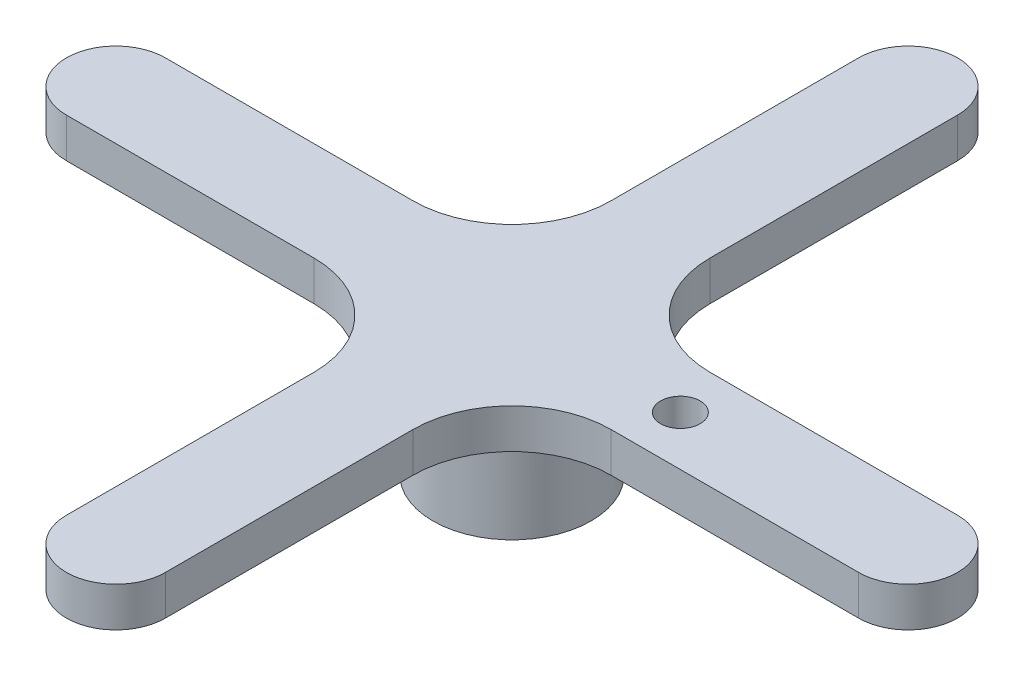
ISO-10303-21;
HEADER;
FILE_DESCRIPTION(('STEP AP214'),'2;1');
FILE_NAME('part.step','',(''),(''),'','','');
FILE_SCHEMA(('AUTOMOTIVE_DESIGN { 1 0 10303 214 1 1 1 1 }'));
ENDSEC;
DATA;
#1=APPLICATION_CONTEXT('core data for automotive mechanical design processes');
#2=APPLICATION_PROTOCOL_DEFINITION('international standard','automotive_design',2000,#1);
#3=PRODUCT_CONTEXT('',#1,'mechanical');
#4=PRODUCT('Part','Part','',(#3));
#5=PRODUCT_RELATED_PRODUCT_CATEGORY('part','',(#4));
#6=PRODUCT_DEFINITION_FORMATION('','',#4);
#7=PRODUCT_DEFINITION_CONTEXT('part definition',#1,'design');
#8=PRODUCT_DEFINITION('design','',#6,#7);
#9=PRODUCT_DEFINITION_SHAPE('','',#8);
#10=(LENGTH_UNIT() NAMED_UNIT(*) SI_UNIT(.MILLI.,.METRE.));
#11=(NAMED_UNIT(*) PLANE_ANGLE_UNIT() SI_UNIT($,.RADIAN.));
#12=(NAMED_UNIT(*) SI_UNIT($,.STERADIAN.) SOLID_ANGLE_UNIT());
#13=UNCERTAINTY_MEASURE_WITH_UNIT(LENGTH_MEASURE(1.E-05),#10,'distance_accuracy_value','');
#14=(GEOMETRIC_REPRESENTATION_CONTEXT(3) GLOBAL_UNCERTAINTY_ASSIGNED_CONTEXT((#13)) GLOBAL_UNIT_ASSIGNED_CONTEXT((#10,
#11,#12)) REPRESENTATION_CONTEXT('',''));
#15=CARTESIAN_POINT('',(0.,0.,0.));
#16=DIRECTION('',(0.,0.,1.));
#17=DIRECTION('',(1.,0.,0.));
#18=AXIS2_PLACEMENT_3D('',#15,#16,#17);
#19=CARTESIAN_POINT('',(-20.,0.,0.));
#20=DIRECTION('',(0.,1.,0.));
#21=DIRECTION('',(0.,0.,1.));
#22=AXIS2_PLACEMENT_3D('',#19,#20,#21);
#23=PLANE('',#22);
#24=CARTESIAN_POINT('',(-20.,0.,0.));
#25=DIRECTION('',(0.,1.,0.));
#26=DIRECTION('',(0.,0.,1.));
#27=AXIS2_PLACEMENT_3D('',#24,#25,#26);
#28=CIRCLE('',#27,2.5);
#29=CARTESIAN_POINT('',(-20.,0.,-2.5));
#30=VERTEX_POINT('',#29);
#31=CARTESIAN_POINT('',(-20.,0.,2.5));
#32=VERTEX_POINT('',#31);
#33=EDGE_CURVE('E232',#30,#32,#28,.T.);
#34=ORIENTED_EDGE('',*,*,#33,.F.);
#35=DIRECTION('',(1.,0.,0.));
#36=VECTOR('',#35,1.);
#37=CARTESIAN_POINT('',(-20.,0.,-2.5));
#38=LINE('',#37,#36);
#39=CARTESIAN_POINT('',(-7.50000000000004,0.,-2.5));
#40=VERTEX_POINT('',#39);
#41=EDGE_CURVE('E273',#30,#40,#38,.T.);
#42=ORIENTED_EDGE('',*,*,#41,.T.);
#43=CARTESIAN_POINT('',(-7.5,0.,-7.5));
#44=DIRECTION('',(0.,1.,0.));
#45=DIRECTION('',(0.,0.,1.));
#46=AXIS2_PLACEMENT_3D('',#43,#44,#45);
#47=CIRCLE('',#46,5.);
#48=CARTESIAN_POINT('',(-2.5,0.,-7.50000000000003));
#49=VERTEX_POINT('',#48);
#50=EDGE_CURVE('E271',#40,#49,#47,.T.);
#51=ORIENTED_EDGE('',*,*,#50,.T.);
#52=DIRECTION('',(0.,0.,1.));
#53=VECTOR('',#52,1.);
#54=CARTESIAN_POINT('',(-2.5,0.,-20.));
#55=LINE('',#54,#53);
#56=CARTESIAN_POINT('',(-2.5,0.,-20.));
#57=VERTEX_POINT('',#56);
#58=EDGE_CURVE('E221',#57,#49,#55,.T.);
#59=ORIENTED_EDGE('',*,*,#58,.F.);
#60=CARTESIAN_POINT('',(0.,0.,-20.));
#61=DIRECTION('',(0.,-1.,0.));
#62=DIRECTION('',(0.,0.,-1.));
#63=AXIS2_PLACEMENT_3D('',#60,#61,#62);
#64=CIRCLE('',#63,2.5);
#65=CARTESIAN_POINT('',(2.5,0.,-20.));
#66=VERTEX_POINT('',#65);
#67=EDGE_CURVE('E267',#57,#66,#64,.T.);
#68=ORIENTED_EDGE('',*,*,#67,.T.);
#69=DIRECTION('',(0.,0.,1.));
#70=VECTOR('',#69,1.);
#71=CARTESIAN_POINT('',(2.5,0.,-20.));
#72=LINE('',#71,#70);
#73=CARTESIAN_POINT('',(2.50000000000001,0.,-7.50000000000002));
#74=VERTEX_POINT('',#73);
#75=EDGE_CURVE('E264',#66,#74,#72,.T.);
#76=ORIENTED_EDGE('',*,*,#75,.T.);
#77=CARTESIAN_POINT('',(7.5,0.,-7.5));
#78=DIRECTION('',(0.,1.,0.));
#79=DIRECTION('',(0.,0.,1.));
#80=AXIS2_PLACEMENT_3D('',#77,#78,#79);
#81=CIRCLE('',#80,4.99999999999999);
#82=CARTESIAN_POINT('',(7.49999999999999,0.,-2.50000000000001));
#83=VERTEX_POINT('',#82);
#84=EDGE_CURVE('E261',#74,#83,#81,.T.);
#85=ORIENTED_EDGE('',*,*,#84,.T.);
#86=DIRECTION('',(1.,0.,0.));
#87=VECTOR('',#86,1.);
#88=CARTESIAN_POINT('',(7.49999999999999,0.,-2.50000000000001));
#89=LINE('',#88,#87);
#90=CARTESIAN_POINT('',(20.,0.,-2.5));
#91=VERTEX_POINT('',#90);
#92=EDGE_CURVE('E258',#83,#91,#89,.T.);
#93=ORIENTED_EDGE('',*,*,#92,.T.);
#94=CARTESIAN_POINT('',(20.,0.,0.));
#95=DIRECTION('',(0.,-1.,0.));
#96=DIRECTION('',(0.,0.,-1.));
#97=AXIS2_PLACEMENT_3D('',#94,#95,#96);
#98=CIRCLE('',#97,2.5);
#99=CARTESIAN_POINT('',(20.,0.,2.5));
#100=VERTEX_POINT('',#99);
#101=EDGE_CURVE('E255',#91,#100,#98,.T.);
#102=ORIENTED_EDGE('',*,*,#101,.T.);
#103=DIRECTION('',(1.,0.,0.));
#104=VECTOR('',#103,1.);
#105=CARTESIAN_POINT('',(7.50000000000004,0.,2.5));
#106=LINE('',#105,#104);
#107=CARTESIAN_POINT('',(7.50000000000004,0.,2.5));
#108=VERTEX_POINT('',#107);
#109=EDGE_CURVE('E252',#108,#100,#106,.T.);
#110=ORIENTED_EDGE('',*,*,#109,.F.);
#111=CARTESIAN_POINT('',(7.5,0.,7.5));
#112=DIRECTION('',(0.,1.,0.));
#113=DIRECTION('',(0.,0.,1.));
#114=AXIS2_PLACEMENT_3D('',#111,#112,#113);
#115=CIRCLE('',#114,5.);
#116=CARTESIAN_POINT('',(2.5,0.,7.50000000000004));
#117=VERTEX_POINT('',#116);
#118=EDGE_CURVE('E249',#108,#117,#115,.T.);
#119=ORIENTED_EDGE('',*,*,#118,.T.);
#120=DIRECTION('',(0.,0.,1.));
#121=VECTOR('',#120,1.);
#122=CARTESIAN_POINT('',(2.5,0.,7.50000000000004));
#123=LINE('',#122,#121);
#124=CARTESIAN_POINT('',(2.5,0.,20.));
#125=VERTEX_POINT('',#124);
#126=EDGE_CURVE('E246',#117,#125,#123,.T.);
#127=ORIENTED_EDGE('',*,*,#126,.T.);
#128=CARTESIAN_POINT('',(0.,0.,20.));
#129=DIRECTION('',(0.,1.,0.));
#130=DIRECTION('',(0.,0.,1.));
#131=AXIS2_PLACEMENT_3D('',#128,#129,#130);
#132=CIRCLE('',#131,2.5);
#133=CARTESIAN_POINT('',(-2.5,0.,20.));
#134=VERTEX_POINT('',#133);
#135=EDGE_CURVE('E243',#134,#125,#132,.T.);
#136=ORIENTED_EDGE('',*,*,#135,.F.);
#137=DIRECTION('',(0.,0.,1.));
#138=VECTOR('',#137,1.);
#139=CARTESIAN_POINT('',(-2.5,0.,7.50000000000003));
#140=LINE('',#139,#138);
#141=CARTESIAN_POINT('',(-2.5,0.,7.50000000000003));
#142=VERTEX_POINT('',#141);
#143=EDGE_CURVE('E241',#142,#134,#140,.T.);
#144=ORIENTED_EDGE('',*,*,#143,.F.);
#145=CARTESIAN_POINT('',(-7.5,0.,7.5));
#146=DIRECTION('',(0.,1.,0.));
#147=DIRECTION('',(0.,0.,1.));
#148=AXIS2_PLACEMENT_3D('',#145,#146,#147);
#149=CIRCLE('',#148,5.);
#150=CARTESIAN_POINT('',(-7.50000000000004,0.,2.5));
#151=VERTEX_POINT('',#150);
#152=EDGE_CURVE('E238',#142,#151,#149,.T.);
#153=ORIENTED_EDGE('',*,*,#152,.T.);
#154=DIRECTION('',(1.,0.,0.));
#155=VECTOR('',#154,1.);
#156=CARTESIAN_POINT('',(-20.,0.,2.5));
#157=LINE('',#156,#155);
#158=EDGE_CURVE('E234',#32,#151,#157,.T.);
#159=ORIENTED_EDGE('',*,*,#158,.F.);
#160=EDGE_LOOP('',(#34,#42,#51,#59,#68,#76,#85,#93,#102,#110,#119,#127,#136,#144,#153,#159));
#161=FACE_BOUND('',#160,.T.);
#162=CARTESIAN_POINT('',(8.5,0.,0.));
#163=DIRECTION('',(0.,1.,0.));
#164=DIRECTION('',(0.,0.,1.));
#165=AXIS2_PLACEMENT_3D('',#162,#163,#164);
#166=CIRCLE('',#165,1.);
#167=CARTESIAN_POINT('',(8.5,0.,1.));
#168=VERTEX_POINT('',#167);
#169=EDGE_CURVE('E346',#168,#168,#166,.T.);
#170=ORIENTED_EDGE('',*,*,#169,.T.);
#171=EDGE_LOOP('',(#170));
#172=FACE_BOUND('',#171,.T.);
#173=CARTESIAN_POINT('',(0.,0.,0.));
#174=DIRECTION('',(0.,1.,0.));
#175=DIRECTION('',(0.,0.,1.));
#176=AXIS2_PLACEMENT_3D('',#173,#174,#175);
#177=CIRCLE('',#176,4.);
#178=CARTESIAN_POINT('',(0.,0.,4.));
#179=VERTEX_POINT('',#178);
#180=EDGE_CURVE('E12',#179,#179,#177,.F.);
#181=ORIENTED_EDGE('',*,*,#180,.F.);
#182=EDGE_LOOP('',(#181));
#183=FACE_BOUND('',#182,.T.);
#184=ADVANCED_FACE('F84',(#161,#172,#183),#23,.F.);
#185=CARTESIAN_POINT('',(-20.,2.,0.));
#186=DIRECTION('',(0.,1.,0.));
#187=DIRECTION('',(0.,0.,1.));
#188=AXIS2_PLACEMENT_3D('',#185,#186,#187);
#189=PLANE('',#188);
#190=CARTESIAN_POINT('',(-20.,2.,0.));
#191=DIRECTION('',(0.,1.,0.));
#192=DIRECTION('',(0.,0.,1.));
#193=AXIS2_PLACEMENT_3D('',#190,#191,#192);
#194=CIRCLE('',#193,2.5);
#195=CARTESIAN_POINT('',(-20.,2.,-2.5));
#196=VERTEX_POINT('',#195);
#197=CARTESIAN_POINT('',(-20.,2.,2.5));
#198=VERTEX_POINT('',#197);
#199=EDGE_CURVE('E276',#196,#198,#194,.T.);
#200=ORIENTED_EDGE('',*,*,#199,.T.);
#201=DIRECTION('',(1.,0.,0.));
#202=VECTOR('',#201,1.);
#203=CARTESIAN_POINT('',(-20.,2.,2.5));
#204=LINE('',#203,#202);
#205=CARTESIAN_POINT('',(-7.50000000000004,2.,2.5));
#206=VERTEX_POINT('',#205);
#207=EDGE_CURVE('E164',#198,#206,#204,.T.);
#208=ORIENTED_EDGE('',*,*,#207,.T.);
#209=CARTESIAN_POINT('',(-7.5,2.,7.5));
#210=DIRECTION('',(0.,1.,0.));
#211=DIRECTION('',(0.,0.,1.));
#212=AXIS2_PLACEMENT_3D('',#209,#210,#211);
#213=CIRCLE('',#212,5.);
#214=CARTESIAN_POINT('',(-2.5,2.,7.50000000000003));
#215=VERTEX_POINT('',#214);
#216=EDGE_CURVE('E353',#215,#206,#213,.T.);
#217=ORIENTED_EDGE('',*,*,#216,.F.);
#218=DIRECTION('',(0.,0.,1.));
#219=VECTOR('',#218,1.);
#220=CARTESIAN_POINT('',(-2.5,2.,7.50000000000003));
#221=LINE('',#220,#219);
#222=CARTESIAN_POINT('',(-2.5,2.,20.));
#223=VERTEX_POINT('',#222);
#224=EDGE_CURVE('E356',#215,#223,#221,.T.);
#225=ORIENTED_EDGE('',*,*,#224,.T.);
#226=CARTESIAN_POINT('',(0.,2.,20.));
#227=DIRECTION('',(0.,1.,0.));
#228=DIRECTION('',(0.,0.,1.));
#229=AXIS2_PLACEMENT_3D('',#226,#227,#228);
#230=CIRCLE('',#229,2.5);
#231=CARTESIAN_POINT('',(2.5,2.,20.));
#232=VERTEX_POINT('',#231);
#233=EDGE_CURVE('E358',#223,#232,#230,.T.);
#234=ORIENTED_EDGE('',*,*,#233,.T.);
#235=DIRECTION('',(0.,0.,1.));
#236=VECTOR('',#235,1.);
#237=CARTESIAN_POINT('',(2.5,2.,7.50000000000004));
#238=LINE('',#237,#236);
#239=CARTESIAN_POINT('',(2.5,2.,7.50000000000004));
#240=VERTEX_POINT('',#239);
#241=EDGE_CURVE('E360',#240,#232,#238,.T.);
#242=ORIENTED_EDGE('',*,*,#241,.F.);
#243=CARTESIAN_POINT('',(7.5,2.,7.5));
#244=DIRECTION('',(0.,1.,0.));
#245=DIRECTION('',(0.,0.,1.));
#246=AXIS2_PLACEMENT_3D('',#243,#244,#245);
#247=CIRCLE('',#246,5.);
#248=CARTESIAN_POINT('',(7.50000000000004,2.,2.5));
#249=VERTEX_POINT('',#248);
#250=EDGE_CURVE('E363',#249,#240,#247,.T.);
#251=ORIENTED_EDGE('',*,*,#250,.F.);
#252=DIRECTION('',(1.,0.,0.));
#253=VECTOR('',#252,1.);
#254=CARTESIAN_POINT('',(7.50000000000004,2.,2.5));
#255=LINE('',#254,#253);
#256=CARTESIAN_POINT('',(20.,2.,2.5));
#257=VERTEX_POINT('',#256);
#258=EDGE_CURVE('E366',#249,#257,#255,.T.);
#259=ORIENTED_EDGE('',*,*,#258,.T.);
#260=CARTESIAN_POINT('',(20.,2.,0.));
#261=DIRECTION('',(0.,-1.,0.));
#262=DIRECTION('',(0.,0.,-1.));
#263=AXIS2_PLACEMENT_3D('',#260,#261,#262);
#264=CIRCLE('',#263,2.5);
#265=CARTESIAN_POINT('',(20.,2.,-2.5));
#266=VERTEX_POINT('',#265);
#267=EDGE_CURVE('E368',#266,#257,#264,.T.);
#268=ORIENTED_EDGE('',*,*,#267,.F.);
#269=DIRECTION('',(1.,0.,0.));
#270=VECTOR('',#269,1.);
#271=CARTESIAN_POINT('',(7.49999999999999,2.,-2.50000000000001));
#272=LINE('',#271,#270);
#273=CARTESIAN_POINT('',(7.49999999999999,2.,-2.50000000000001));
#274=VERTEX_POINT('',#273);
#275=EDGE_CURVE('E371',#274,#266,#272,.T.);
#276=ORIENTED_EDGE('',*,*,#275,.F.);
#277=CARTESIAN_POINT('',(7.5,2.,-7.5));
#278=DIRECTION('',(0.,1.,0.));
#279=DIRECTION('',(0.,0.,1.));
#280=AXIS2_PLACEMENT_3D('',#277,#278,#279);
#281=CIRCLE('',#280,4.99999999999999);
#282=CARTESIAN_POINT('',(2.50000000000001,2.,-7.50000000000002));
#283=VERTEX_POINT('',#282);
#284=EDGE_CURVE('E374',#283,#274,#281,.T.);
#285=ORIENTED_EDGE('',*,*,#284,.F.);
#286=DIRECTION('',(0.,0.,1.));
#287=VECTOR('',#286,1.);
#288=CARTESIAN_POINT('',(2.5,2.,-20.));
#289=LINE('',#288,#287);
#290=CARTESIAN_POINT('',(2.5,2.,-20.));
#291=VERTEX_POINT('',#290);
#292=EDGE_CURVE('E377',#291,#283,#289,.T.);
#293=ORIENTED_EDGE('',*,*,#292,.F.);
#294=CARTESIAN_POINT('',(0.,2.,-20.));
#295=DIRECTION('',(0.,-1.,0.));
#296=DIRECTION('',(0.,0.,-1.));
#297=AXIS2_PLACEMENT_3D('',#294,#295,#296);
#298=CIRCLE('',#297,2.5);
#299=CARTESIAN_POINT('',(-2.5,2.,-20.));
#300=VERTEX_POINT('',#299);
#301=EDGE_CURVE('E214',#300,#291,#298,.T.);
#302=ORIENTED_EDGE('',*,*,#301,.F.);
#303=DIRECTION('',(0.,0.,1.));
#304=VECTOR('',#303,1.);
#305=CARTESIAN_POINT('',(-2.5,2.,-20.));
#306=LINE('',#305,#304);
#307=CARTESIAN_POINT('',(-2.5,2.,-7.50000000000003));
#308=VERTEX_POINT('',#307);
#309=EDGE_CURVE('E205',#300,#308,#306,.T.);
#310=ORIENTED_EDGE('',*,*,#309,.T.);
#311=CARTESIAN_POINT('',(-7.5,2.,-7.5));
#312=DIRECTION('',(0.,1.,0.));
#313=DIRECTION('',(0.,0.,1.));
#314=AXIS2_PLACEMENT_3D('',#311,#312,#313);
#315=CIRCLE('',#314,5.);
#316=CARTESIAN_POINT('',(-7.50000000000004,2.,-2.5));
#317=VERTEX_POINT('',#316);
#318=EDGE_CURVE('E211',#317,#308,#315,.T.);
#319=ORIENTED_EDGE('',*,*,#318,.F.);
#320=DIRECTION('',(1.,0.,0.));
#321=VECTOR('',#320,1.);
#322=CARTESIAN_POINT('',(-20.,2.,-2.5));
#323=LINE('',#322,#321);
#324=EDGE_CURVE('E227',#196,#317,#323,.T.);
#325=ORIENTED_EDGE('',*,*,#324,.F.);
#326=EDGE_LOOP('',(#200,#208,#217,#225,#234,#242,#251,#259,#268,#276,#285,#293,#302,#310,#319,#325));
#327=FACE_BOUND('',#326,.T.);
#328=CARTESIAN_POINT('',(8.5,2.,0.));
#329=DIRECTION('',(0.,1.,0.));
#330=DIRECTION('',(0.,0.,1.));
#331=AXIS2_PLACEMENT_3D('',#328,#329,#330);
#332=CIRCLE('',#331,1.);
#333=CARTESIAN_POINT('',(8.5,2.,1.));
#334=VERTEX_POINT('',#333);
#335=EDGE_CURVE('E235',#334,#334,#332,.T.);
#336=ORIENTED_EDGE('',*,*,#335,.F.);
#337=EDGE_LOOP('',(#336));
#338=FACE_BOUND('',#337,.T.);
#339=ADVANCED_FACE('F207',(#327,#338),#189,.T.);
#340=CARTESIAN_POINT('',(-20.,2.,0.));
#341=DIRECTION('',(0.,-1.,0.));
#342=DIRECTION('',(0.,0.,-1.));
#343=AXIS2_PLACEMENT_3D('',#340,#341,#342);
#344=CYLINDRICAL_SURFACE('',#343,2.5);
#345=ORIENTED_EDGE('',*,*,#33,.T.);
#346=DIRECTION('',(0.,-1.,0.));
#347=VECTOR('',#346,1.);
#348=CARTESIAN_POINT('',(-20.,2.,2.5));
#349=LINE('',#348,#347);
#350=EDGE_CURVE('E93',#198,#32,#349,.T.);
#351=ORIENTED_EDGE('',*,*,#350,.F.);
#352=ORIENTED_EDGE('',*,*,#199,.F.);
#353=DIRECTION('',(0.,-1.,0.));
#354=VECTOR('',#353,1.);
#355=CARTESIAN_POINT('',(-20.,2.,-2.5));
#356=LINE('',#355,#354);
#357=EDGE_CURVE('E101',#196,#30,#356,.T.);
#358=ORIENTED_EDGE('',*,*,#357,.T.);
#359=EDGE_LOOP('',(#345,#351,#352,#358));
#360=FACE_BOUND('',#359,.T.);
#361=ADVANCED_FACE('F86',(#360),#344,.T.);
#362=CARTESIAN_POINT('',(-20.,2.,2.5));
#363=DIRECTION('',(0.,0.,-1.));
#364=DIRECTION('',(-1.,0.,0.));
#365=AXIS2_PLACEMENT_3D('',#362,#363,#364);
#366=PLANE('',#365);
#367=ORIENTED_EDGE('',*,*,#158,.T.);
#368=DIRECTION('',(0.,-1.,0.));
#369=VECTOR('',#368,1.);
#370=CARTESIAN_POINT('',(-7.50000000000004,2.,2.5));
#371=LINE('',#370,#369);
#372=EDGE_CURVE('E301',#206,#151,#371,.T.);
#373=ORIENTED_EDGE('',*,*,#372,.F.);
#374=ORIENTED_EDGE('',*,*,#207,.F.);
#375=ORIENTED_EDGE('',*,*,#350,.T.);
#376=EDGE_LOOP('',(#367,#373,#374,#375));
#377=FACE_BOUND('',#376,.T.);
#378=ADVANCED_FACE('F303',(#377),#366,.F.);
#379=CARTESIAN_POINT('',(-7.5,2.,7.5));
#380=DIRECTION('',(0.,-1.,0.));
#381=DIRECTION('',(0.,0.,-1.));
#382=AXIS2_PLACEMENT_3D('',#379,#380,#381);
#383=CYLINDRICAL_SURFACE('',#382,5.);
#384=ORIENTED_EDGE('',*,*,#152,.F.);
#385=DIRECTION('',(0.,-1.,0.));
#386=VECTOR('',#385,1.);
#387=CARTESIAN_POINT('',(-2.5,2.,7.50000000000003));
#388=LINE('',#387,#386);
#389=EDGE_CURVE('E299',#215,#142,#388,.T.);
#390=ORIENTED_EDGE('',*,*,#389,.F.);
#391=ORIENTED_EDGE('',*,*,#216,.T.);
#392=ORIENTED_EDGE('',*,*,#372,.T.);
#393=EDGE_LOOP('',(#384,#390,#391,#392));
#394=FACE_BOUND('',#393,.T.);
#395=ADVANCED_FACE('F423',(#394),#383,.F.);
#396=CARTESIAN_POINT('',(-2.5,2.,7.50000000000003));
#397=DIRECTION('',(1.,0.,0.));
#398=DIRECTION('',(0.,0.,-1.));
#399=AXIS2_PLACEMENT_3D('',#396,#397,#398);
#400=PLANE('',#399);
#401=ORIENTED_EDGE('',*,*,#143,.T.);
#402=DIRECTION('',(0.,-1.,0.));
#403=VECTOR('',#402,1.);
#404=CARTESIAN_POINT('',(-2.5,2.,20.));
#405=LINE('',#404,#403);
#406=EDGE_CURVE('E296',#223,#134,#405,.T.);
#407=ORIENTED_EDGE('',*,*,#406,.F.);
#408=ORIENTED_EDGE('',*,*,#224,.F.);
#409=ORIENTED_EDGE('',*,*,#389,.T.);
#410=EDGE_LOOP('',(#401,#407,#408,#409));
#411=FACE_BOUND('',#410,.T.);
#412=ADVANCED_FACE('F419',(#411),#400,.F.);
#413=CARTESIAN_POINT('',(0.,2.,20.));
#414=DIRECTION('',(0.,-1.,0.));
#415=DIRECTION('',(0.,0.,-1.));
#416=AXIS2_PLACEMENT_3D('',#413,#414,#415);
#417=CYLINDRICAL_SURFACE('',#416,2.5);
#418=ORIENTED_EDGE('',*,*,#135,.T.);
#419=DIRECTION('',(0.,-1.,0.));
#420=VECTOR('',#419,1.);
#421=CARTESIAN_POINT('',(2.5,2.,20.));
#422=LINE('',#421,#420);
#423=EDGE_CURVE('E294',#232,#125,#422,.T.);
#424=ORIENTED_EDGE('',*,*,#423,.F.);
#425=ORIENTED_EDGE('',*,*,#233,.F.);
#426=ORIENTED_EDGE('',*,*,#406,.T.);
#427=EDGE_LOOP('',(#418,#424,#425,#426));
#428=FACE_BOUND('',#427,.T.);
#429=ADVANCED_FACE('F415',(#428),#417,.T.);
#430=CARTESIAN_POINT('',(2.5,2.,7.50000000000004));
#431=DIRECTION('',(1.,0.,0.));
#432=DIRECTION('',(0.,0.,-1.));
#433=AXIS2_PLACEMENT_3D('',#430,#431,#432);
#434=PLANE('',#433);
#435=ORIENTED_EDGE('',*,*,#126,.F.);
#436=DIRECTION('',(0.,-1.,0.));
#437=VECTOR('',#436,1.);
#438=CARTESIAN_POINT('',(2.5,2.,7.50000000000004));
#439=LINE('',#438,#437);
#440=EDGE_CURVE('E292',#240,#117,#439,.T.);
#441=ORIENTED_EDGE('',*,*,#440,.F.);
#442=ORIENTED_EDGE('',*,*,#241,.T.);
#443=ORIENTED_EDGE('',*,*,#423,.T.);
#444=EDGE_LOOP('',(#435,#441,#442,#443));
#445=FACE_BOUND('',#444,.T.);
#446=ADVANCED_FACE('F410',(#445),#434,.T.);
#447=CARTESIAN_POINT('',(7.5,2.,7.5));
#448=DIRECTION('',(0.,-1.,0.));
#449=DIRECTION('',(0.,0.,-1.));
#450=AXIS2_PLACEMENT_3D('',#447,#448,#449);
#451=CYLINDRICAL_SURFACE('',#450,5.);
#452=ORIENTED_EDGE('',*,*,#118,.F.);
#453=DIRECTION('',(0.,-1.,0.));
#454=VECTOR('',#453,1.);
#455=CARTESIAN_POINT('',(7.50000000000004,2.,2.5));
#456=LINE('',#455,#454);
#457=EDGE_CURVE('E290',#249,#108,#456,.T.);
#458=ORIENTED_EDGE('',*,*,#457,.F.);
#459=ORIENTED_EDGE('',*,*,#250,.T.);
#460=ORIENTED_EDGE('',*,*,#440,.T.);
#461=EDGE_LOOP('',(#452,#458,#459,#460));
#462=FACE_BOUND('',#461,.T.);
#463=ADVANCED_FACE('F405',(#462),#451,.F.);
#464=CARTESIAN_POINT('',(7.50000000000004,2.,2.5));
#465=DIRECTION('',(0.,0.,-1.));
#466=DIRECTION('',(-1.,0.,0.));
#467=AXIS2_PLACEMENT_3D('',#464,#465,#466);
#468=PLANE('',#467);
#469=ORIENTED_EDGE('',*,*,#109,.T.);
#470=DIRECTION('',(0.,-1.,0.));
#471=VECTOR('',#470,1.);
#472=CARTESIAN_POINT('',(20.,2.,2.5));
#473=LINE('',#472,#471);
#474=EDGE_CURVE('E288',#257,#100,#473,.T.);
#475=ORIENTED_EDGE('',*,*,#474,.F.);
#476=ORIENTED_EDGE('',*,*,#258,.F.);
#477=ORIENTED_EDGE('',*,*,#457,.T.);
#478=EDGE_LOOP('',(#469,#475,#476,#477));
#479=FACE_BOUND('',#478,.T.);
#480=ADVANCED_FACE('F402',(#479),#468,.F.);
#481=CARTESIAN_POINT('',(20.,2.,0.));
#482=DIRECTION('',(0.,-1.,0.));
#483=DIRECTION('',(0.,0.,-1.));
#484=AXIS2_PLACEMENT_3D('',#481,#482,#483);
#485=CYLINDRICAL_SURFACE('',#484,2.5);
#486=ORIENTED_EDGE('',*,*,#101,.F.);
#487=DIRECTION('',(0.,-1.,0.));
#488=VECTOR('',#487,1.);
#489=CARTESIAN_POINT('',(20.,2.,-2.5));
#490=LINE('',#489,#488);
#491=EDGE_CURVE('E286',#266,#91,#490,.T.);
#492=ORIENTED_EDGE('',*,*,#491,.F.);
#493=ORIENTED_EDGE('',*,*,#267,.T.);
#494=ORIENTED_EDGE('',*,*,#474,.T.);
#495=EDGE_LOOP('',(#486,#492,#493,#494));
#496=FACE_BOUND('',#495,.T.);
#497=ADVANCED_FACE('F397',(#496),#485,.T.);
#498=CARTESIAN_POINT('',(7.49999999999999,2.,-2.50000000000001));
#499=DIRECTION('',(0.,0.,-1.));
#500=DIRECTION('',(-1.,0.,0.));
#501=AXIS2_PLACEMENT_3D('',#498,#499,#500);
#502=PLANE('',#501);
#503=ORIENTED_EDGE('',*,*,#92,.F.);
#504=DIRECTION('',(0.,-1.,0.));
#505=VECTOR('',#504,1.);
#506=CARTESIAN_POINT('',(7.49999999999999,2.,-2.50000000000001));
#507=LINE('',#506,#505);
#508=EDGE_CURVE('E284',#274,#83,#507,.T.);
#509=ORIENTED_EDGE('',*,*,#508,.F.);
#510=ORIENTED_EDGE('',*,*,#275,.T.);
#511=ORIENTED_EDGE('',*,*,#491,.T.);
#512=EDGE_LOOP('',(#503,#509,#510,#511));
#513=FACE_BOUND('',#512,.T.);
#514=ADVANCED_FACE('F392',(#513),#502,.T.);
#515=CARTESIAN_POINT('',(7.5,2.,-7.5));
#516=DIRECTION('',(0.,-1.,0.));
#517=DIRECTION('',(0.,0.,-1.));
#518=AXIS2_PLACEMENT_3D('',#515,#516,#517);
#519=CYLINDRICAL_SURFACE('',#518,4.99999999999999);
#520=ORIENTED_EDGE('',*,*,#84,.F.);
#521=DIRECTION('',(0.,-1.,0.));
#522=VECTOR('',#521,1.);
#523=CARTESIAN_POINT('',(2.50000000000001,2.,-7.50000000000002));
#524=LINE('',#523,#522);
#525=EDGE_CURVE('E282',#283,#74,#524,.T.);
#526=ORIENTED_EDGE('',*,*,#525,.F.);
#527=ORIENTED_EDGE('',*,*,#284,.T.);
#528=ORIENTED_EDGE('',*,*,#508,.T.);
#529=EDGE_LOOP('',(#520,#526,#527,#528));
#530=FACE_BOUND('',#529,.T.);
#531=ADVANCED_FACE('F388',(#530),#519,.F.);
#532=CARTESIAN_POINT('',(2.5,2.,-20.));
#533=DIRECTION('',(1.,0.,0.));
#534=DIRECTION('',(0.,0.,-1.));
#535=AXIS2_PLACEMENT_3D('',#532,#533,#534);
#536=PLANE('',#535);
#537=ORIENTED_EDGE('',*,*,#75,.F.);
#538=DIRECTION('',(0.,-1.,0.));
#539=VECTOR('',#538,1.);
#540=CARTESIAN_POINT('',(2.5,2.,-20.));
#541=LINE('',#540,#539);
#542=EDGE_CURVE('E280',#291,#66,#541,.T.);
#543=ORIENTED_EDGE('',*,*,#542,.F.);
#544=ORIENTED_EDGE('',*,*,#292,.T.);
#545=ORIENTED_EDGE('',*,*,#525,.T.);
#546=EDGE_LOOP('',(#537,#543,#544,#545));
#547=FACE_BOUND('',#546,.T.);
#548=ADVANCED_FACE('F385',(#547),#536,.T.);
#549=CARTESIAN_POINT('',(0.,2.,-20.));
#550=DIRECTION('',(0.,-1.,0.));
#551=DIRECTION('',(0.,0.,-1.));
#552=AXIS2_PLACEMENT_3D('',#549,#550,#551);
#553=CYLINDRICAL_SURFACE('',#552,2.5);
#554=ORIENTED_EDGE('',*,*,#67,.F.);
#555=DIRECTION('',(0.,-1.,0.));
#556=VECTOR('',#555,1.);
#557=CARTESIAN_POINT('',(-2.5,2.,-20.));
#558=LINE('',#557,#556);
#559=EDGE_CURVE('E224',#300,#57,#558,.T.);
#560=ORIENTED_EDGE('',*,*,#559,.F.);
#561=ORIENTED_EDGE('',*,*,#301,.T.);
#562=ORIENTED_EDGE('',*,*,#542,.T.);
#563=EDGE_LOOP('',(#554,#560,#561,#562));
#564=FACE_BOUND('',#563,.T.);
#565=ADVANCED_FACE('F381',(#564),#553,.T.);
#566=CARTESIAN_POINT('',(-2.5,2.,-20.));
#567=DIRECTION('',(1.,0.,0.));
#568=DIRECTION('',(0.,0.,-1.));
#569=AXIS2_PLACEMENT_3D('',#566,#567,#568);
#570=PLANE('',#569);
#571=ORIENTED_EDGE('',*,*,#58,.T.);
#572=DIRECTION('',(0.,-1.,0.));
#573=VECTOR('',#572,1.);
#574=CARTESIAN_POINT('',(-2.5,2.,-7.50000000000003));
#575=LINE('',#574,#573);
#576=EDGE_CURVE('E218',#308,#49,#575,.T.);
#577=ORIENTED_EDGE('',*,*,#576,.F.);
#578=ORIENTED_EDGE('',*,*,#309,.F.);
#579=ORIENTED_EDGE('',*,*,#559,.T.);
#580=EDGE_LOOP('',(#571,#577,#578,#579));
#581=FACE_BOUND('',#580,.T.);
#582=ADVANCED_FACE('F219',(#581),#570,.F.);
#583=CARTESIAN_POINT('',(-7.5,2.,-7.5));
#584=DIRECTION('',(0.,-1.,0.));
#585=DIRECTION('',(0.,0.,-1.));
#586=AXIS2_PLACEMENT_3D('',#583,#584,#585);
#587=CYLINDRICAL_SURFACE('',#586,5.);
#588=ORIENTED_EDGE('',*,*,#50,.F.);
#589=DIRECTION('',(0.,-1.,0.));
#590=VECTOR('',#589,1.);
#591=CARTESIAN_POINT('',(-7.50000000000004,2.,-2.5));
#592=LINE('',#591,#590);
#593=EDGE_CURVE('E151',#317,#40,#592,.T.);
#594=ORIENTED_EDGE('',*,*,#593,.F.);
#595=ORIENTED_EDGE('',*,*,#318,.T.);
#596=ORIENTED_EDGE('',*,*,#576,.T.);
#597=EDGE_LOOP('',(#588,#594,#595,#596));
#598=FACE_BOUND('',#597,.T.);
#599=ADVANCED_FACE('F226',(#598),#587,.F.);
#600=CARTESIAN_POINT('',(-20.,2.,-2.5));
#601=DIRECTION('',(0.,0.,-1.));
#602=DIRECTION('',(-1.,0.,0.));
#603=AXIS2_PLACEMENT_3D('',#600,#601,#602);
#604=PLANE('',#603);
#605=ORIENTED_EDGE('',*,*,#41,.F.);
#606=ORIENTED_EDGE('',*,*,#357,.F.);
#607=ORIENTED_EDGE('',*,*,#324,.T.);
#608=ORIENTED_EDGE('',*,*,#593,.T.);
#609=EDGE_LOOP('',(#605,#606,#607,#608));
#610=FACE_BOUND('',#609,.T.);
#611=ADVANCED_FACE('F306',(#610),#604,.T.);
#612=CARTESIAN_POINT('',(8.5,2.,0.));
#613=DIRECTION('',(0.,-1.,0.));
#614=DIRECTION('',(0.,0.,-1.));
#615=AXIS2_PLACEMENT_3D('',#612,#613,#614);
#616=CYLINDRICAL_SURFACE('',#615,1.);
#617=ORIENTED_EDGE('',*,*,#335,.T.);
#618=EDGE_LOOP('',(#617));
#619=FACE_BOUND('',#618,.T.);
#620=ORIENTED_EDGE('',*,*,#169,.F.);
#621=EDGE_LOOP('',(#620));
#622=FACE_BOUND('',#621,.T.);
#623=ADVANCED_FACE('F308',(#619,#622),#616,.F.);
#624=CARTESIAN_POINT('',(0.,-5.,0.));
#625=DIRECTION('',(0.,-1.,0.));
#626=DIRECTION('',(0.,0.,-1.));
#627=AXIS2_PLACEMENT_3D('',#624,#625,#626);
#628=PLANE('',#627);
#629=CARTESIAN_POINT('',(0.,-5.,0.));
#630=DIRECTION('',(0.,-1.,0.));
#631=DIRECTION('',(0.,0.,-1.));
#632=AXIS2_PLACEMENT_3D('',#629,#630,#631);
#633=CIRCLE('',#632,4.);
#634=CARTESIAN_POINT('',(0.,-5.,-4.));
#635=VERTEX_POINT('',#634);
#636=EDGE_CURVE('E341',#635,#635,#633,.T.);
#637=ORIENTED_EDGE('',*,*,#636,.T.);
#638=EDGE_LOOP('',(#637));
#639=FACE_BOUND('',#638,.T.);
#640=CARTESIAN_POINT('',(0.,-5.,0.));
#641=DIRECTION('',(0.,-1.,0.));
#642=DIRECTION('',(0.,0.,-1.));
#643=AXIS2_PLACEMENT_3D('',#640,#641,#642);
#644=CIRCLE('',#643,2.95);
#645=CARTESIAN_POINT('',(0.,-5.,-2.95));
#646=VERTEX_POINT('',#645);
#647=EDGE_CURVE('E338',#646,#646,#644,.T.);
#648=ORIENTED_EDGE('',*,*,#647,.F.);
#649=EDGE_LOOP('',(#648));
#650=FACE_BOUND('',#649,.T.);
#651=ADVANCED_FACE('F314',(#639,#650),#628,.T.);
#652=CARTESIAN_POINT('',(0.,-5.,0.));
#653=DIRECTION('',(0.,1.,0.));
#654=DIRECTION('',(0.,0.,1.));
#655=AXIS2_PLACEMENT_3D('',#652,#653,#654);
#656=CYLINDRICAL_SURFACE('',#655,4.);
#657=ORIENTED_EDGE('',*,*,#636,.F.);
#658=EDGE_LOOP('',(#657));
#659=FACE_BOUND('',#658,.T.);
#660=ORIENTED_EDGE('',*,*,#180,.T.);
#661=EDGE_LOOP('',(#660));
#662=FACE_BOUND('',#661,.T.);
#663=ADVANCED_FACE('F331',(#659,#662),#656,.T.);
#664=CARTESIAN_POINT('',(0.,-5.,0.));
#665=DIRECTION('',(0.,1.,0.));
#666=DIRECTION('',(0.,0.,1.));
#667=AXIS2_PLACEMENT_3D('',#664,#665,#666);
#668=CYLINDRICAL_SURFACE('',#667,2.95);
#669=ORIENTED_EDGE('',*,*,#647,.T.);
#670=EDGE_LOOP('',(#669));
#671=FACE_BOUND('',#670,.T.);
#672=CARTESIAN_POINT('',(0.,0.,0.));
#673=DIRECTION('',(0.,-1.,0.));
#674=DIRECTION('',(0.,0.,-1.));
#675=AXIS2_PLACEMENT_3D('',#672,#673,#674);
#676=CIRCLE('',#675,2.95);
#677=CARTESIAN_POINT('',(0.,0.,-2.95));
#678=VERTEX_POINT('',#677);
#679=EDGE_CURVE('E336',#678,#678,#676,.T.);
#680=ORIENTED_EDGE('',*,*,#679,.F.);
#681=EDGE_LOOP('',(#680));
#682=FACE_BOUND('',#681,.T.);
#683=ADVANCED_FACE('F326',(#671,#682),#668,.F.);
#684=ORIENTED_EDGE('',*,*,#679,.T.);
#685=EDGE_LOOP('',(#684));
#686=FACE_BOUND('',#685,.T.);
#687=ADVANCED_FACE('F320',(#686),#23,.F.);
#688=CLOSED_SHELL('',(#184,#339,#361,#378,#395,#412,#429,#446,#463,#480,#497,#514,#531,#548,
#565,#582,#599,#611,#623,#651,#663,#683,#687));
#689=MANIFOLD_SOLID_BREP('B2',#688);
#690=ADVANCED_BREP_SHAPE_REPRESENTATION('',(#18,#689),#14);
#691=SHAPE_DEFINITION_REPRESENTATION(#9,#690);
ENDSEC;
END-ISO-10303-21;
